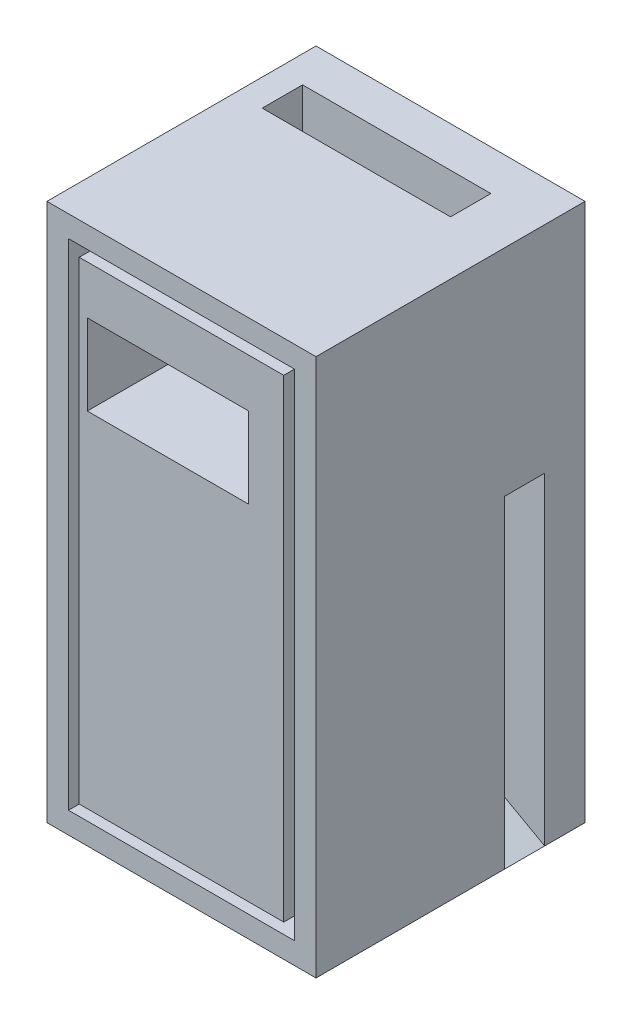
ISO-10303-21;
HEADER;
FILE_DESCRIPTION(('STEP AP214'),'2;1');
FILE_NAME('part.step','',(''),(''),'','','');
FILE_SCHEMA(('AUTOMOTIVE_DESIGN { 1 0 10303 214 1 1 1 1 }'));
ENDSEC;
DATA;
#1=APPLICATION_CONTEXT('core data for automotive mechanical design processes');
#2=APPLICATION_PROTOCOL_DEFINITION('international standard','automotive_design',2000,#1);
#3=PRODUCT_CONTEXT('',#1,'mechanical');
#4=PRODUCT('Part','Part','',(#3));
#5=PRODUCT_RELATED_PRODUCT_CATEGORY('part','',(#4));
#6=PRODUCT_DEFINITION_FORMATION('','',#4);
#7=PRODUCT_DEFINITION_CONTEXT('part definition',#1,'design');
#8=PRODUCT_DEFINITION('design','',#6,#7);
#9=PRODUCT_DEFINITION_SHAPE('','',#8);
#10=(LENGTH_UNIT() NAMED_UNIT(*) SI_UNIT(.MILLI.,.METRE.));
#11=(NAMED_UNIT(*) PLANE_ANGLE_UNIT() SI_UNIT($,.RADIAN.));
#12=(NAMED_UNIT(*) SI_UNIT($,.STERADIAN.) SOLID_ANGLE_UNIT());
#13=UNCERTAINTY_MEASURE_WITH_UNIT(LENGTH_MEASURE(1.E-05),#10,'distance_accuracy_value','');
#14=(GEOMETRIC_REPRESENTATION_CONTEXT(3) GLOBAL_UNCERTAINTY_ASSIGNED_CONTEXT((#13)) GLOBAL_UNIT_ASSIGNED_CONTEXT((#10,
#11,#12)) REPRESENTATION_CONTEXT('',''));
#15=CARTESIAN_POINT('',(0.,0.,0.));
#16=DIRECTION('',(0.,0.,1.));
#17=DIRECTION('',(1.,0.,0.));
#18=AXIS2_PLACEMENT_3D('',#15,#16,#17);
#19=CARTESIAN_POINT('',(0.,0.,25.));
#20=DIRECTION('',(0.,0.,-1.));
#21=DIRECTION('',(-1.,0.,0.));
#22=AXIS2_PLACEMENT_3D('',#19,#20,#21);
#23=PLANE('',#22);
#24=DIRECTION('',(1.,0.,0.));
#25=VECTOR('',#24,1.);
#26=CARTESIAN_POINT('',(2.5,70.,25.));
#27=LINE('',#26,#25);
#28=CARTESIAN_POINT('',(2.5,70.,25.));
#29=VERTEX_POINT('',#28);
#30=CARTESIAN_POINT('',(32.5,70.,25.));
#31=VERTEX_POINT('',#30);
#32=EDGE_CURVE('E270',#29,#31,#27,.T.);
#33=ORIENTED_EDGE('',*,*,#32,.F.);
#34=DIRECTION('',(0.,-1.,0.));
#35=VECTOR('',#34,1.);
#36=CARTESIAN_POINT('',(2.5,70.,25.));
#37=LINE('',#36,#35);
#38=CARTESIAN_POINT('',(2.5,85.,25.));
#39=VERTEX_POINT('',#38);
#40=EDGE_CURVE('E273',#39,#29,#37,.T.);
#41=ORIENTED_EDGE('',*,*,#40,.F.);
#42=DIRECTION('',(-1.,0.,0.));
#43=VECTOR('',#42,1.);
#44=CARTESIAN_POINT('',(2.5,85.,25.));
#45=LINE('',#44,#43);
#46=CARTESIAN_POINT('',(32.5,85.,25.));
#47=VERTEX_POINT('',#46);
#48=EDGE_CURVE('E264',#47,#39,#45,.T.);
#49=ORIENTED_EDGE('',*,*,#48,.F.);
#50=DIRECTION('',(0.,1.,0.));
#51=VECTOR('',#50,1.);
#52=CARTESIAN_POINT('',(32.5,70.,25.));
#53=LINE('',#52,#51);
#54=EDGE_CURVE('E267',#31,#47,#53,.T.);
#55=ORIENTED_EDGE('',*,*,#54,.F.);
#56=EDGE_LOOP('',(#33,#41,#49,#55));
#57=FACE_BOUND('',#56,.T.);
#58=DIRECTION('',(0.,-1.,0.));
#59=VECTOR('',#58,1.);
#60=CARTESIAN_POINT('',(1.,94.,25.));
#61=LINE('',#60,#59);
#62=CARTESIAN_POINT('',(1.,94.,25.));
#63=VERTEX_POINT('',#62);
#64=CARTESIAN_POINT('',(1.,6.,25.));
#65=VERTEX_POINT('',#64);
#66=EDGE_CURVE('E221',#63,#65,#61,.T.);
#67=ORIENTED_EDGE('',*,*,#66,.T.);
#68=DIRECTION('',(1.,0.,0.));
#69=VECTOR('',#68,1.);
#70=CARTESIAN_POINT('',(1.,6.,25.));
#71=LINE('',#70,#69);
#72=CARTESIAN_POINT('',(39.,6.,25.));
#73=VERTEX_POINT('',#72);
#74=EDGE_CURVE('E194',#65,#73,#71,.T.);
#75=ORIENTED_EDGE('',*,*,#74,.T.);
#76=DIRECTION('',(0.,1.,0.));
#77=VECTOR('',#76,1.);
#78=CARTESIAN_POINT('',(39.,6.,25.));
#79=LINE('',#78,#77);
#80=CARTESIAN_POINT('',(39.,94.,25.));
#81=VERTEX_POINT('',#80);
#82=EDGE_CURVE('E62',#73,#81,#79,.T.);
#83=ORIENTED_EDGE('',*,*,#82,.T.);
#84=DIRECTION('',(-1.,0.,0.));
#85=VECTOR('',#84,1.);
#86=CARTESIAN_POINT('',(39.,94.,25.));
#87=LINE('',#86,#85);
#88=EDGE_CURVE('E214',#81,#63,#87,.T.);
#89=ORIENTED_EDGE('',*,*,#88,.T.);
#90=EDGE_LOOP('',(#67,#75,#83,#89));
#91=FACE_BOUND('',#90,.T.);
#92=ADVANCED_FACE('F39',(#57,#91),#23,.F.);
#93=CARTESIAN_POINT('',(45.,100.,-10.));
#94=DIRECTION('',(0.,0.,1.));
#95=DIRECTION('',(1.,0.,0.));
#96=AXIS2_PLACEMENT_3D('',#93,#94,#95);
#97=PLANE('',#96);
#98=DIRECTION('',(1.,0.,0.));
#99=VECTOR('',#98,1.);
#100=CARTESIAN_POINT('',(2.50000000000001,85.,-10.));
#101=LINE('',#100,#99);
#102=CARTESIAN_POINT('',(2.5,85.,-10.));
#103=VERTEX_POINT('',#102);
#104=CARTESIAN_POINT('',(32.5,85.,-10.));
#105=VERTEX_POINT('',#104);
#106=EDGE_CURVE('E278',#103,#105,#101,.T.);
#107=ORIENTED_EDGE('',*,*,#106,.F.);
#108=DIRECTION('',(0.,1.,0.));
#109=VECTOR('',#108,1.);
#110=CARTESIAN_POINT('',(2.5,70.,-10.));
#111=LINE('',#110,#109);
#112=CARTESIAN_POINT('',(2.5,70.,-10.));
#113=VERTEX_POINT('',#112);
#114=EDGE_CURVE('E263',#113,#103,#111,.T.);
#115=ORIENTED_EDGE('',*,*,#114,.F.);
#116=DIRECTION('',(-1.,0.,0.));
#117=VECTOR('',#116,1.);
#118=CARTESIAN_POINT('',(2.50000000000001,70.,-10.));
#119=LINE('',#118,#117);
#120=CARTESIAN_POINT('',(32.5,70.,-10.));
#121=VERTEX_POINT('',#120);
#122=EDGE_CURVE('E260',#121,#113,#119,.T.);
#123=ORIENTED_EDGE('',*,*,#122,.F.);
#124=DIRECTION('',(0.,-1.,0.));
#125=VECTOR('',#124,1.);
#126=CARTESIAN_POINT('',(32.5,70.,-10.));
#127=LINE('',#126,#125);
#128=EDGE_CURVE('E281',#105,#121,#127,.T.);
#129=ORIENTED_EDGE('',*,*,#128,.F.);
#130=EDGE_LOOP('',(#107,#115,#123,#129));
#131=FACE_BOUND('',#130,.T.);
#132=DIRECTION('',(0.,-1.,0.));
#133=VECTOR('',#132,1.);
#134=CARTESIAN_POINT('',(35.,100.,-10.));
#135=LINE('',#134,#133);
#136=CARTESIAN_POINT('',(35.,100.,-10.));
#137=VERTEX_POINT('',#136);
#138=CARTESIAN_POINT('',(35.,60.,-9.99999999999999));
#139=VERTEX_POINT('',#138);
#140=EDGE_CURVE('E299',#137,#139,#135,.T.);
#141=ORIENTED_EDGE('',*,*,#140,.T.);
#142=DIRECTION('',(1.,0.,0.));
#143=VECTOR('',#142,1.);
#144=CARTESIAN_POINT('',(45.,60.,-10.));
#145=LINE('',#144,#143);
#146=CARTESIAN_POINT('',(45.,60.,-10.));
#147=VERTEX_POINT('',#146);
#148=EDGE_CURVE('E293',#139,#147,#145,.T.);
#149=ORIENTED_EDGE('',*,*,#148,.T.);
#150=DIRECTION('',(0.,-1.,0.));
#151=VECTOR('',#150,1.);
#152=CARTESIAN_POINT('',(45.,100.,-10.));
#153=LINE('',#152,#151);
#154=CARTESIAN_POINT('',(45.,0.,-10.));
#155=VERTEX_POINT('',#154);
#156=EDGE_CURVE('E343',#147,#155,#153,.T.);
#157=ORIENTED_EDGE('',*,*,#156,.T.);
#158=DIRECTION('',(-0.874157276121538,0.485642931178632,0.));
#159=VECTOR('',#158,1.);
#160=CARTESIAN_POINT('',(45.,0.,-10.));
#161=LINE('',#160,#159);
#162=CARTESIAN_POINT('',(0.,25.,-9.99999999999999));
#163=VERTEX_POINT('',#162);
#164=EDGE_CURVE('E345',#155,#163,#161,.T.);
#165=ORIENTED_EDGE('',*,*,#164,.T.);
#166=DIRECTION('',(0.,-1.,0.));
#167=VECTOR('',#166,1.);
#168=CARTESIAN_POINT('',(0.,109.01387818866,-9.99999999999999));
#169=LINE('',#168,#167);
#170=CARTESIAN_POINT('',(0.,100.,-9.99999999999999));
#171=VERTEX_POINT('',#170);
#172=EDGE_CURVE('E302',#171,#163,#169,.T.);
#173=ORIENTED_EDGE('',*,*,#172,.F.);
#174=DIRECTION('',(-1.,0.,0.));
#175=VECTOR('',#174,1.);
#176=CARTESIAN_POINT('',(45.,100.,-10.));
#177=LINE('',#176,#175);
#178=EDGE_CURVE('E334',#137,#171,#177,.T.);
#179=ORIENTED_EDGE('',*,*,#178,.F.);
#180=EDGE_LOOP('',(#141,#149,#157,#165,#173,#179));
#181=FACE_BOUND('',#180,.T.);
#182=ADVANCED_FACE('F384',(#131,#181),#97,.F.);
#183=CARTESIAN_POINT('',(-5.,100.,-17.5));
#184=DIRECTION('',(0.,0.,-1.));
#185=DIRECTION('',(-1.,0.,0.));
#186=AXIS2_PLACEMENT_3D('',#183,#184,#185);
#187=PLANE('',#186);
#188=DIRECTION('',(0.,-1.,0.));
#189=VECTOR('',#188,1.);
#190=CARTESIAN_POINT('',(35.,100.,-17.5));
#191=LINE('',#190,#189);
#192=CARTESIAN_POINT('',(35.,100.,-17.5));
#193=VERTEX_POINT('',#192);
#194=CARTESIAN_POINT('',(35.,60.,-17.5));
#195=VERTEX_POINT('',#194);
#196=EDGE_CURVE('E295',#193,#195,#191,.T.);
#197=ORIENTED_EDGE('',*,*,#196,.F.);
#198=DIRECTION('',(1.,0.,0.));
#199=VECTOR('',#198,1.);
#200=CARTESIAN_POINT('',(-5.,100.,-17.5));
#201=LINE('',#200,#199);
#202=CARTESIAN_POINT('',(0.,100.,-17.5));
#203=VERTEX_POINT('',#202);
#204=EDGE_CURVE('E325',#203,#193,#201,.T.);
#205=ORIENTED_EDGE('',*,*,#204,.F.);
#206=DIRECTION('',(0.,-1.,0.));
#207=VECTOR('',#206,1.);
#208=CARTESIAN_POINT('',(0.,109.01387818866,-17.5));
#209=LINE('',#208,#207);
#210=CARTESIAN_POINT('',(0.,25.,-17.5));
#211=VERTEX_POINT('',#210);
#212=EDGE_CURVE('E312',#203,#211,#209,.T.);
#213=ORIENTED_EDGE('',*,*,#212,.T.);
#214=DIRECTION('',(0.874157276121538,-0.485642931178632,0.));
#215=VECTOR('',#214,1.);
#216=CARTESIAN_POINT('',(45.,0.,-17.5));
#217=LINE('',#216,#215);
#218=CARTESIAN_POINT('',(45.,0.,-17.5));
#219=VERTEX_POINT('',#218);
#220=EDGE_CURVE('E324',#211,#219,#217,.T.);
#221=ORIENTED_EDGE('',*,*,#220,.T.);
#222=DIRECTION('',(0.,-1.,0.));
#223=VECTOR('',#222,1.);
#224=CARTESIAN_POINT('',(45.,100.,-17.5));
#225=LINE('',#224,#223);
#226=CARTESIAN_POINT('',(45.,60.,-17.5));
#227=VERTEX_POINT('',#226);
#228=EDGE_CURVE('E311',#227,#219,#225,.T.);
#229=ORIENTED_EDGE('',*,*,#228,.F.);
#230=DIRECTION('',(1.,0.,0.));
#231=VECTOR('',#230,1.);
#232=CARTESIAN_POINT('',(45.,60.,-17.5));
#233=LINE('',#232,#231);
#234=EDGE_CURVE('E291',#195,#227,#233,.T.);
#235=ORIENTED_EDGE('',*,*,#234,.F.);
#236=EDGE_LOOP('',(#197,#205,#213,#221,#229,#235));
#237=FACE_BOUND('',#236,.T.);
#238=ADVANCED_FACE('F375',(#237),#187,.F.);
#239=CARTESIAN_POINT('',(45.,0.,25.));
#240=DIRECTION('',(-0.485642931178632,-0.874157276121538,0.));
#241=DIRECTION('',(0.874157276121538,-0.485642931178632,0.));
#242=AXIS2_PLACEMENT_3D('',#239,#240,#241);
#243=PLANE('',#242);
#244=ORIENTED_EDGE('',*,*,#220,.F.);
#245=DIRECTION('',(0.,0.,-1.));
#246=VECTOR('',#245,1.);
#247=CARTESIAN_POINT('',(0.,25.,25.));
#248=LINE('',#247,#246);
#249=EDGE_CURVE('E359',#163,#211,#248,.T.);
#250=ORIENTED_EDGE('',*,*,#249,.F.);
#251=ORIENTED_EDGE('',*,*,#164,.F.);
#252=DIRECTION('',(0.,0.,-1.));
#253=VECTOR('',#252,1.);
#254=CARTESIAN_POINT('',(45.,0.,25.));
#255=LINE('',#254,#253);
#256=EDGE_CURVE('E47',#155,#219,#255,.T.);
#257=ORIENTED_EDGE('',*,*,#256,.T.);
#258=EDGE_LOOP('',(#244,#250,#251,#257));
#259=FACE_BOUND('',#258,.T.);
#260=ADVANCED_FACE('F368',(#259),#243,.F.);
#261=CARTESIAN_POINT('',(0.,0.,25.));
#262=DIRECTION('',(0.,1.,0.));
#263=DIRECTION('',(0.,0.,1.));
#264=AXIS2_PLACEMENT_3D('',#261,#262,#263);
#265=PLANE('',#264);
#266=DIRECTION('',(0.,0.,-1.));
#267=VECTOR('',#266,1.);
#268=CARTESIAN_POINT('',(45.,0.,-25.));
#269=LINE('',#268,#267);
#270=CARTESIAN_POINT('',(45.,0.,-25.));
#271=VERTEX_POINT('',#270);
#272=EDGE_CURVE('E321',#219,#271,#269,.T.);
#273=ORIENTED_EDGE('',*,*,#272,.F.);
#274=ORIENTED_EDGE('',*,*,#256,.F.);
#275=CARTESIAN_POINT('',(45.,0.,25.));
#276=VERTEX_POINT('',#275);
#277=EDGE_CURVE('E11',#276,#155,#255,.T.);
#278=ORIENTED_EDGE('',*,*,#277,.F.);
#279=DIRECTION('',(1.,0.,0.));
#280=VECTOR('',#279,1.);
#281=CARTESIAN_POINT('',(0.,0.,25.));
#282=LINE('',#281,#280);
#283=CARTESIAN_POINT('',(-5.,0.,25.));
#284=VERTEX_POINT('',#283);
#285=EDGE_CURVE('E349',#284,#276,#282,.T.);
#286=ORIENTED_EDGE('',*,*,#285,.F.);
#287=DIRECTION('',(0.,0.,-1.));
#288=VECTOR('',#287,1.);
#289=CARTESIAN_POINT('',(-5.,0.,25.));
#290=LINE('',#289,#288);
#291=CARTESIAN_POINT('',(-5.,0.,-25.));
#292=VERTEX_POINT('',#291);
#293=EDGE_CURVE('E355',#284,#292,#290,.T.);
#294=ORIENTED_EDGE('',*,*,#293,.T.);
#295=DIRECTION('',(1.,0.,0.));
#296=VECTOR('',#295,1.);
#297=CARTESIAN_POINT('',(0.,0.,-25.));
#298=LINE('',#297,#296);
#299=EDGE_CURVE('E348',#292,#271,#298,.T.);
#300=ORIENTED_EDGE('',*,*,#299,.T.);
#301=EDGE_LOOP('',(#273,#274,#278,#286,#294,#300));
#302=FACE_BOUND('',#301,.T.);
#303=ADVANCED_FACE('F41',(#302),#265,.F.);
#304=CARTESIAN_POINT('',(-5.,0.,25.));
#305=DIRECTION('',(1.,0.,0.));
#306=DIRECTION('',(0.,0.,-1.));
#307=AXIS2_PLACEMENT_3D('',#304,#305,#306);
#308=PLANE('',#307);
#309=DIRECTION('',(0.,-1.,0.));
#310=VECTOR('',#309,1.);
#311=CARTESIAN_POINT('',(-5.,0.,-25.));
#312=LINE('',#311,#310);
#313=CARTESIAN_POINT('',(-5.,100.,-25.));
#314=VERTEX_POINT('',#313);
#315=EDGE_CURVE('E353',#314,#292,#312,.T.);
#316=ORIENTED_EDGE('',*,*,#315,.T.);
#317=ORIENTED_EDGE('',*,*,#293,.F.);
#318=DIRECTION('',(0.,-1.,0.));
#319=VECTOR('',#318,1.);
#320=CARTESIAN_POINT('',(-5.,0.,25.));
#321=LINE('',#320,#319);
#322=CARTESIAN_POINT('',(-5.,100.,25.));
#323=VERTEX_POINT('',#322);
#324=EDGE_CURVE('E352',#323,#284,#321,.T.);
#325=ORIENTED_EDGE('',*,*,#324,.F.);
#326=DIRECTION('',(0.,0.,1.));
#327=VECTOR('',#326,1.);
#328=CARTESIAN_POINT('',(-5.,100.,25.));
#329=LINE('',#328,#327);
#330=EDGE_CURVE('E336',#314,#323,#329,.T.);
#331=ORIENTED_EDGE('',*,*,#330,.F.);
#332=EDGE_LOOP('',(#316,#317,#325,#331));
#333=FACE_BOUND('',#332,.T.);
#334=ADVANCED_FACE('F398',(#333),#308,.F.);
#335=DIRECTION('',(1.,0.,0.));
#336=VECTOR('',#335,1.);
#337=CARTESIAN_POINT('',(-1.,4.,25.));
#338=LINE('',#337,#336);
#339=CARTESIAN_POINT('',(-1.,4.,25.));
#340=VERTEX_POINT('',#339);
#341=CARTESIAN_POINT('',(41.,4.,25.));
#342=VERTEX_POINT('',#341);
#343=EDGE_CURVE('E244',#340,#342,#338,.T.);
#344=ORIENTED_EDGE('',*,*,#343,.F.);
#345=DIRECTION('',(0.,-1.,0.));
#346=VECTOR('',#345,1.);
#347=CARTESIAN_POINT('',(-1.,96.,25.));
#348=LINE('',#347,#346);
#349=CARTESIAN_POINT('',(-1.,96.,25.));
#350=VERTEX_POINT('',#349);
#351=EDGE_CURVE('E54',#350,#340,#348,.T.);
#352=ORIENTED_EDGE('',*,*,#351,.F.);
#353=DIRECTION('',(-1.,0.,0.));
#354=VECTOR('',#353,1.);
#355=CARTESIAN_POINT('',(41.,96.,25.));
#356=LINE('',#355,#354);
#357=CARTESIAN_POINT('',(41.,96.,25.));
#358=VERTEX_POINT('',#357);
#359=EDGE_CURVE('E233',#358,#350,#356,.T.);
#360=ORIENTED_EDGE('',*,*,#359,.F.);
#361=DIRECTION('',(0.,1.,0.));
#362=VECTOR('',#361,1.);
#363=CARTESIAN_POINT('',(41.,4.,25.));
#364=LINE('',#363,#362);
#365=EDGE_CURVE('E247',#342,#358,#364,.T.);
#366=ORIENTED_EDGE('',*,*,#365,.F.);
#367=EDGE_LOOP('',(#344,#352,#360,#366));
#368=FACE_BOUND('',#367,.T.);
#369=ORIENTED_EDGE('',*,*,#285,.T.);
#370=DIRECTION('',(0.,-1.,0.));
#371=VECTOR('',#370,1.);
#372=CARTESIAN_POINT('',(45.,100.,25.));
#373=LINE('',#372,#371);
#374=CARTESIAN_POINT('',(45.,100.,25.));
#375=VERTEX_POINT('',#374);
#376=EDGE_CURVE('E341',#375,#276,#373,.T.);
#377=ORIENTED_EDGE('',*,*,#376,.F.);
#378=DIRECTION('',(1.,0.,0.));
#379=VECTOR('',#378,1.);
#380=CARTESIAN_POINT('',(45.,100.,25.));
#381=LINE('',#380,#379);
#382=EDGE_CURVE('E339',#323,#375,#381,.T.);
#383=ORIENTED_EDGE('',*,*,#382,.F.);
#384=ORIENTED_EDGE('',*,*,#324,.T.);
#385=EDGE_LOOP('',(#369,#377,#383,#384));
#386=FACE_BOUND('',#385,.T.);
#387=ADVANCED_FACE('F395',(#368,#386),#23,.F.);
#388=CARTESIAN_POINT('',(0.,0.,-25.));
#389=DIRECTION('',(0.,0.,-1.));
#390=DIRECTION('',(-1.,0.,0.));
#391=AXIS2_PLACEMENT_3D('',#388,#389,#390);
#392=PLANE('',#391);
#393=ORIENTED_EDGE('',*,*,#299,.F.);
#394=ORIENTED_EDGE('',*,*,#315,.F.);
#395=DIRECTION('',(-1.,0.,0.));
#396=VECTOR('',#395,1.);
#397=CARTESIAN_POINT('',(-5.,100.,-25.));
#398=LINE('',#397,#396);
#399=CARTESIAN_POINT('',(45.,100.,-25.));
#400=VERTEX_POINT('',#399);
#401=EDGE_CURVE('E320',#400,#314,#398,.T.);
#402=ORIENTED_EDGE('',*,*,#401,.F.);
#403=DIRECTION('',(0.,-1.,0.));
#404=VECTOR('',#403,1.);
#405=CARTESIAN_POINT('',(45.,100.,-25.));
#406=LINE('',#405,#404);
#407=EDGE_CURVE('E317',#400,#271,#406,.T.);
#408=ORIENTED_EDGE('',*,*,#407,.T.);
#409=EDGE_LOOP('',(#393,#394,#402,#408));
#410=FACE_BOUND('',#409,.T.);
#411=ADVANCED_FACE('F402',(#410),#392,.T.);
#412=CARTESIAN_POINT('',(45.,100.,25.));
#413=DIRECTION('',(-1.,0.,0.));
#414=DIRECTION('',(0.,0.,1.));
#415=AXIS2_PLACEMENT_3D('',#412,#413,#414);
#416=PLANE('',#415);
#417=ORIENTED_EDGE('',*,*,#277,.T.);
#418=ORIENTED_EDGE('',*,*,#156,.F.);
#419=DIRECTION('',(0.,0.,-1.));
#420=VECTOR('',#419,1.);
#421=CARTESIAN_POINT('',(45.,60.,31.2310562561766));
#422=LINE('',#421,#420);
#423=EDGE_CURVE('E283',#147,#227,#422,.T.);
#424=ORIENTED_EDGE('',*,*,#423,.T.);
#425=ORIENTED_EDGE('',*,*,#228,.T.);
#426=ORIENTED_EDGE('',*,*,#272,.T.);
#427=ORIENTED_EDGE('',*,*,#407,.F.);
#428=DIRECTION('',(0.,0.,-1.));
#429=VECTOR('',#428,1.);
#430=CARTESIAN_POINT('',(45.,100.,25.));
#431=LINE('',#430,#429);
#432=EDGE_CURVE('E332',#375,#400,#431,.T.);
#433=ORIENTED_EDGE('',*,*,#432,.F.);
#434=ORIENTED_EDGE('',*,*,#376,.T.);
#435=EDGE_LOOP('',(#417,#418,#424,#425,#426,#427,#433,#434));
#436=FACE_BOUND('',#435,.T.);
#437=ADVANCED_FACE('F388',(#436),#416,.F.);
#438=CARTESIAN_POINT('',(0.,100.,0.));
#439=DIRECTION('',(0.,1.,0.));
#440=DIRECTION('',(0.,0.,1.));
#441=AXIS2_PLACEMENT_3D('',#438,#439,#440);
#442=PLANE('',#441);
#443=ORIENTED_EDGE('',*,*,#204,.T.);
#444=DIRECTION('',(0.,0.,-1.));
#445=VECTOR('',#444,1.);
#446=CARTESIAN_POINT('',(35.,100.,31.2310562561766));
#447=LINE('',#446,#445);
#448=EDGE_CURVE('E298',#137,#193,#447,.T.);
#449=ORIENTED_EDGE('',*,*,#448,.F.);
#450=ORIENTED_EDGE('',*,*,#178,.T.);
#451=DIRECTION('',(0.,0.,-1.));
#452=VECTOR('',#451,1.);
#453=CARTESIAN_POINT('',(0.,100.,-17.5));
#454=LINE('',#453,#452);
#455=EDGE_CURVE('E309',#171,#203,#454,.T.);
#456=ORIENTED_EDGE('',*,*,#455,.T.);
#457=EDGE_LOOP('',(#443,#449,#450,#456));
#458=FACE_BOUND('',#457,.T.);
#459=ORIENTED_EDGE('',*,*,#432,.T.);
#460=ORIENTED_EDGE('',*,*,#401,.T.);
#461=ORIENTED_EDGE('',*,*,#330,.T.);
#462=ORIENTED_EDGE('',*,*,#382,.T.);
#463=EDGE_LOOP('',(#459,#460,#461,#462));
#464=FACE_BOUND('',#463,.T.);
#465=ADVANCED_FACE('F404',(#458,#464),#442,.T.);
#466=CARTESIAN_POINT('',(0.,109.01387818866,-17.5));
#467=DIRECTION('',(-1.,0.,0.));
#468=DIRECTION('',(0.,0.,1.));
#469=AXIS2_PLACEMENT_3D('',#466,#467,#468);
#470=PLANE('',#469);
#471=ORIENTED_EDGE('',*,*,#455,.F.);
#472=ORIENTED_EDGE('',*,*,#172,.T.);
#473=ORIENTED_EDGE('',*,*,#249,.T.);
#474=ORIENTED_EDGE('',*,*,#212,.F.);
#475=EDGE_LOOP('',(#471,#472,#473,#474));
#476=FACE_BOUND('',#475,.T.);
#477=ADVANCED_FACE('F379',(#476),#470,.F.);
#478=CARTESIAN_POINT('',(35.,100.,31.2310562561766));
#479=DIRECTION('',(1.,0.,0.));
#480=DIRECTION('',(0.,1.,0.));
#481=AXIS2_PLACEMENT_3D('',#478,#479,#480);
#482=PLANE('',#481);
#483=ORIENTED_EDGE('',*,*,#140,.F.);
#484=ORIENTED_EDGE('',*,*,#448,.T.);
#485=ORIENTED_EDGE('',*,*,#196,.T.);
#486=DIRECTION('',(0.,0.,-1.));
#487=VECTOR('',#486,1.);
#488=CARTESIAN_POINT('',(35.,60.,31.2310562561766));
#489=LINE('',#488,#487);
#490=EDGE_CURVE('E294',#139,#195,#489,.T.);
#491=ORIENTED_EDGE('',*,*,#490,.F.);
#492=EDGE_LOOP('',(#483,#484,#485,#491));
#493=FACE_BOUND('',#492,.T.);
#494=ADVANCED_FACE('F410',(#493),#482,.F.);
#495=CARTESIAN_POINT('',(45.,60.,31.2310562561766));
#496=DIRECTION('',(0.,1.,0.));
#497=DIRECTION('',(0.,0.,1.));
#498=AXIS2_PLACEMENT_3D('',#495,#496,#497);
#499=PLANE('',#498);
#500=ORIENTED_EDGE('',*,*,#148,.F.);
#501=ORIENTED_EDGE('',*,*,#490,.T.);
#502=ORIENTED_EDGE('',*,*,#234,.T.);
#503=ORIENTED_EDGE('',*,*,#423,.F.);
#504=EDGE_LOOP('',(#500,#501,#502,#503));
#505=FACE_BOUND('',#504,.T.);
#506=ADVANCED_FACE('F407',(#505),#499,.F.);
#507=CARTESIAN_POINT('',(2.5,70.,-25.001));
#508=DIRECTION('',(-1.,0.,0.));
#509=DIRECTION('',(0.,0.,1.));
#510=AXIS2_PLACEMENT_3D('',#507,#508,#509);
#511=PLANE('',#510);
#512=ORIENTED_EDGE('',*,*,#114,.T.);
#513=DIRECTION('',(0.,0.,1.));
#514=VECTOR('',#513,1.);
#515=CARTESIAN_POINT('',(2.5,85.,-25.001));
#516=LINE('',#515,#514);
#517=EDGE_CURVE('E284',#103,#39,#516,.T.);
#518=ORIENTED_EDGE('',*,*,#517,.T.);
#519=ORIENTED_EDGE('',*,*,#40,.T.);
#520=DIRECTION('',(0.,0.,1.));
#521=VECTOR('',#520,1.);
#522=CARTESIAN_POINT('',(2.5,70.,-25.001));
#523=LINE('',#522,#521);
#524=EDGE_CURVE('E254',#113,#29,#523,.T.);
#525=ORIENTED_EDGE('',*,*,#524,.F.);
#526=EDGE_LOOP('',(#512,#518,#519,#525));
#527=FACE_BOUND('',#526,.T.);
#528=ADVANCED_FACE('F417',(#527),#511,.F.);
#529=CARTESIAN_POINT('',(2.5,85.,-25.001));
#530=DIRECTION('',(0.,1.,0.));
#531=DIRECTION('',(0.,0.,1.));
#532=AXIS2_PLACEMENT_3D('',#529,#530,#531);
#533=PLANE('',#532);
#534=ORIENTED_EDGE('',*,*,#106,.T.);
#535=DIRECTION('',(0.,0.,1.));
#536=VECTOR('',#535,1.);
#537=CARTESIAN_POINT('',(32.5,85.,-25.001));
#538=LINE('',#537,#536);
#539=EDGE_CURVE('E286',#105,#47,#538,.T.);
#540=ORIENTED_EDGE('',*,*,#539,.T.);
#541=ORIENTED_EDGE('',*,*,#48,.T.);
#542=ORIENTED_EDGE('',*,*,#517,.F.);
#543=EDGE_LOOP('',(#534,#540,#541,#542));
#544=FACE_BOUND('',#543,.T.);
#545=ADVANCED_FACE('F473',(#544),#533,.F.);
#546=CARTESIAN_POINT('',(32.5,70.,-25.001));
#547=DIRECTION('',(1.,0.,0.));
#548=DIRECTION('',(0.,0.,-1.));
#549=AXIS2_PLACEMENT_3D('',#546,#547,#548);
#550=PLANE('',#549);
#551=ORIENTED_EDGE('',*,*,#128,.T.);
#552=DIRECTION('',(0.,0.,1.));
#553=VECTOR('',#552,1.);
#554=CARTESIAN_POINT('',(32.5,70.,-25.001));
#555=LINE('',#554,#553);
#556=EDGE_CURVE('E275',#121,#31,#555,.T.);
#557=ORIENTED_EDGE('',*,*,#556,.T.);
#558=ORIENTED_EDGE('',*,*,#54,.T.);
#559=ORIENTED_EDGE('',*,*,#539,.F.);
#560=EDGE_LOOP('',(#551,#557,#558,#559));
#561=FACE_BOUND('',#560,.T.);
#562=ADVANCED_FACE('F469',(#561),#550,.F.);
#563=CARTESIAN_POINT('',(2.5,70.,-25.001));
#564=DIRECTION('',(0.,-1.,0.));
#565=DIRECTION('',(0.,0.,-1.));
#566=AXIS2_PLACEMENT_3D('',#563,#564,#565);
#567=PLANE('',#566);
#568=ORIENTED_EDGE('',*,*,#122,.T.);
#569=ORIENTED_EDGE('',*,*,#524,.T.);
#570=ORIENTED_EDGE('',*,*,#32,.T.);
#571=ORIENTED_EDGE('',*,*,#556,.F.);
#572=EDGE_LOOP('',(#568,#569,#570,#571));
#573=FACE_BOUND('',#572,.T.);
#574=ADVANCED_FACE('F467',(#573),#567,.F.);
#575=CARTESIAN_POINT('',(-1.,96.,10.));
#576=DIRECTION('',(-1.,0.,0.));
#577=DIRECTION('',(0.,0.,1.));
#578=AXIS2_PLACEMENT_3D('',#575,#576,#577);
#579=PLANE('',#578);
#580=ORIENTED_EDGE('',*,*,#351,.T.);
#581=DIRECTION('',(0.,0.,1.));
#582=VECTOR('',#581,1.);
#583=CARTESIAN_POINT('',(-1.,4.,10.));
#584=LINE('',#583,#582);
#585=CARTESIAN_POINT('',(-1.,4.,10.));
#586=VERTEX_POINT('',#585);
#587=EDGE_CURVE('E242',#586,#340,#584,.T.);
#588=ORIENTED_EDGE('',*,*,#587,.F.);
#589=DIRECTION('',(0.,-1.,0.));
#590=VECTOR('',#589,1.);
#591=CARTESIAN_POINT('',(-1.,96.,10.));
#592=LINE('',#591,#590);
#593=CARTESIAN_POINT('',(-1.,96.,10.));
#594=VERTEX_POINT('',#593);
#595=EDGE_CURVE('E229',#594,#586,#592,.T.);
#596=ORIENTED_EDGE('',*,*,#595,.F.);
#597=DIRECTION('',(0.,0.,1.));
#598=VECTOR('',#597,1.);
#599=CARTESIAN_POINT('',(-1.,96.,10.));
#600=LINE('',#599,#598);
#601=EDGE_CURVE('E252',#594,#350,#600,.T.);
#602=ORIENTED_EDGE('',*,*,#601,.T.);
#603=EDGE_LOOP('',(#580,#588,#596,#602));
#604=FACE_BOUND('',#603,.T.);
#605=ADVANCED_FACE('F450',(#604),#579,.F.);
#606=CARTESIAN_POINT('',(41.,96.,10.));
#607=DIRECTION('',(0.,1.,0.));
#608=DIRECTION('',(0.,0.,1.));
#609=AXIS2_PLACEMENT_3D('',#606,#607,#608);
#610=PLANE('',#609);
#611=ORIENTED_EDGE('',*,*,#359,.T.);
#612=ORIENTED_EDGE('',*,*,#601,.F.);
#613=DIRECTION('',(-1.,0.,0.));
#614=VECTOR('',#613,1.);
#615=CARTESIAN_POINT('',(41.,96.,10.));
#616=LINE('',#615,#614);
#617=CARTESIAN_POINT('',(41.,96.,10.));
#618=VERTEX_POINT('',#617);
#619=EDGE_CURVE('E239',#618,#594,#616,.T.);
#620=ORIENTED_EDGE('',*,*,#619,.F.);
#621=DIRECTION('',(0.,0.,1.));
#622=VECTOR('',#621,1.);
#623=CARTESIAN_POINT('',(41.,96.,10.));
#624=LINE('',#623,#622);
#625=EDGE_CURVE('E255',#618,#358,#624,.T.);
#626=ORIENTED_EDGE('',*,*,#625,.T.);
#627=EDGE_LOOP('',(#611,#612,#620,#626));
#628=FACE_BOUND('',#627,.T.);
#629=ADVANCED_FACE('F453',(#628),#610,.F.);
#630=CARTESIAN_POINT('',(41.,4.,10.));
#631=DIRECTION('',(1.,0.,0.));
#632=DIRECTION('',(0.,0.,-1.));
#633=AXIS2_PLACEMENT_3D('',#630,#631,#632);
#634=PLANE('',#633);
#635=ORIENTED_EDGE('',*,*,#365,.T.);
#636=ORIENTED_EDGE('',*,*,#625,.F.);
#637=DIRECTION('',(0.,1.,0.));
#638=VECTOR('',#637,1.);
#639=CARTESIAN_POINT('',(41.,4.,10.));
#640=LINE('',#639,#638);
#641=CARTESIAN_POINT('',(41.,4.,10.));
#642=VERTEX_POINT('',#641);
#643=EDGE_CURVE('E236',#642,#618,#640,.T.);
#644=ORIENTED_EDGE('',*,*,#643,.F.);
#645=DIRECTION('',(0.,0.,1.));
#646=VECTOR('',#645,1.);
#647=CARTESIAN_POINT('',(41.,4.,10.));
#648=LINE('',#647,#646);
#649=EDGE_CURVE('E257',#642,#342,#648,.T.);
#650=ORIENTED_EDGE('',*,*,#649,.T.);
#651=EDGE_LOOP('',(#635,#636,#644,#650));
#652=FACE_BOUND('',#651,.T.);
#653=ADVANCED_FACE('F455',(#652),#634,.F.);
#654=CARTESIAN_POINT('',(-1.,4.,10.));
#655=DIRECTION('',(0.,-1.,0.));
#656=DIRECTION('',(0.,0.,-1.));
#657=AXIS2_PLACEMENT_3D('',#654,#655,#656);
#658=PLANE('',#657);
#659=ORIENTED_EDGE('',*,*,#343,.T.);
#660=ORIENTED_EDGE('',*,*,#649,.F.);
#661=DIRECTION('',(1.,0.,0.));
#662=VECTOR('',#661,1.);
#663=CARTESIAN_POINT('',(-1.,4.,10.));
#664=LINE('',#663,#662);
#665=EDGE_CURVE('E232',#586,#642,#664,.T.);
#666=ORIENTED_EDGE('',*,*,#665,.F.);
#667=ORIENTED_EDGE('',*,*,#587,.T.);
#668=EDGE_LOOP('',(#659,#660,#666,#667));
#669=FACE_BOUND('',#668,.T.);
#670=ADVANCED_FACE('F446',(#669),#658,.F.);
#671=CARTESIAN_POINT('',(0.,0.,10.));
#672=DIRECTION('',(0.,0.,1.));
#673=DIRECTION('',(1.,0.,0.));
#674=AXIS2_PLACEMENT_3D('',#671,#672,#673);
#675=PLANE('',#674);
#676=DIRECTION('',(-1.,0.,0.));
#677=VECTOR('',#676,1.);
#678=CARTESIAN_POINT('',(39.,94.,10.));
#679=LINE('',#678,#677);
#680=CARTESIAN_POINT('',(39.,94.,10.));
#681=VERTEX_POINT('',#680);
#682=CARTESIAN_POINT('',(1.,94.,10.));
#683=VERTEX_POINT('',#682);
#684=EDGE_CURVE('E200',#681,#683,#679,.T.);
#685=ORIENTED_EDGE('',*,*,#684,.F.);
#686=DIRECTION('',(0.,1.,0.));
#687=VECTOR('',#686,1.);
#688=CARTESIAN_POINT('',(39.,6.,10.));
#689=LINE('',#688,#687);
#690=CARTESIAN_POINT('',(39.,6.,10.));
#691=VERTEX_POINT('',#690);
#692=EDGE_CURVE('E210',#691,#681,#689,.T.);
#693=ORIENTED_EDGE('',*,*,#692,.F.);
#694=DIRECTION('',(1.,0.,0.));
#695=VECTOR('',#694,1.);
#696=CARTESIAN_POINT('',(1.,6.,10.));
#697=LINE('',#696,#695);
#698=CARTESIAN_POINT('',(1.,6.,10.));
#699=VERTEX_POINT('',#698);
#700=EDGE_CURVE('E192',#699,#691,#697,.T.);
#701=ORIENTED_EDGE('',*,*,#700,.F.);
#702=DIRECTION('',(0.,-1.,0.));
#703=VECTOR('',#702,1.);
#704=CARTESIAN_POINT('',(1.,94.,10.));
#705=LINE('',#704,#703);
#706=EDGE_CURVE('E207',#683,#699,#705,.T.);
#707=ORIENTED_EDGE('',*,*,#706,.F.);
#708=EDGE_LOOP('',(#685,#693,#701,#707));
#709=FACE_BOUND('',#708,.T.);
#710=ORIENTED_EDGE('',*,*,#595,.T.);
#711=ORIENTED_EDGE('',*,*,#665,.T.);
#712=ORIENTED_EDGE('',*,*,#643,.T.);
#713=ORIENTED_EDGE('',*,*,#619,.T.);
#714=EDGE_LOOP('',(#710,#711,#712,#713));
#715=FACE_BOUND('',#714,.T.);
#716=ADVANCED_FACE('F205',(#709,#715),#675,.T.);
#717=CARTESIAN_POINT('',(1.,94.,10.));
#718=DIRECTION('',(-1.,0.,0.));
#719=DIRECTION('',(0.,0.,1.));
#720=AXIS2_PLACEMENT_3D('',#717,#718,#719);
#721=PLANE('',#720);
#722=ORIENTED_EDGE('',*,*,#66,.F.);
#723=DIRECTION('',(0.,0.,1.));
#724=VECTOR('',#723,1.);
#725=CARTESIAN_POINT('',(1.,94.,10.));
#726=LINE('',#725,#724);
#727=EDGE_CURVE('E213',#683,#63,#726,.T.);
#728=ORIENTED_EDGE('',*,*,#727,.F.);
#729=ORIENTED_EDGE('',*,*,#706,.T.);
#730=DIRECTION('',(0.,0.,1.));
#731=VECTOR('',#730,1.);
#732=CARTESIAN_POINT('',(1.,6.,10.));
#733=LINE('',#732,#731);
#734=EDGE_CURVE('E189',#699,#65,#733,.T.);
#735=ORIENTED_EDGE('',*,*,#734,.T.);
#736=EDGE_LOOP('',(#722,#728,#729,#735));
#737=FACE_BOUND('',#736,.T.);
#738=ADVANCED_FACE('F212',(#737),#721,.T.);
#739=CARTESIAN_POINT('',(39.,94.,10.));
#740=DIRECTION('',(0.,1.,0.));
#741=DIRECTION('',(0.,0.,1.));
#742=AXIS2_PLACEMENT_3D('',#739,#740,#741);
#743=PLANE('',#742);
#744=ORIENTED_EDGE('',*,*,#88,.F.);
#745=DIRECTION('',(0.,0.,1.));
#746=VECTOR('',#745,1.);
#747=CARTESIAN_POINT('',(39.,94.,10.));
#748=LINE('',#747,#746);
#749=EDGE_CURVE('E226',#681,#81,#748,.T.);
#750=ORIENTED_EDGE('',*,*,#749,.F.);
#751=ORIENTED_EDGE('',*,*,#684,.T.);
#752=ORIENTED_EDGE('',*,*,#727,.T.);
#753=EDGE_LOOP('',(#744,#750,#751,#752));
#754=FACE_BOUND('',#753,.T.);
#755=ADVANCED_FACE('F554',(#754),#743,.T.);
#756=CARTESIAN_POINT('',(39.,6.,10.));
#757=DIRECTION('',(1.,0.,0.));
#758=DIRECTION('',(0.,0.,-1.));
#759=AXIS2_PLACEMENT_3D('',#756,#757,#758);
#760=PLANE('',#759);
#761=ORIENTED_EDGE('',*,*,#82,.F.);
#762=DIRECTION('',(0.,0.,1.));
#763=VECTOR('',#762,1.);
#764=CARTESIAN_POINT('',(39.,6.,10.));
#765=LINE('',#764,#763);
#766=EDGE_CURVE('E199',#691,#73,#765,.T.);
#767=ORIENTED_EDGE('',*,*,#766,.F.);
#768=ORIENTED_EDGE('',*,*,#692,.T.);
#769=ORIENTED_EDGE('',*,*,#749,.T.);
#770=EDGE_LOOP('',(#761,#767,#768,#769));
#771=FACE_BOUND('',#770,.T.);
#772=ADVANCED_FACE('F563',(#771),#760,.T.);
#773=CARTESIAN_POINT('',(1.,6.,10.));
#774=DIRECTION('',(0.,-1.,0.));
#775=DIRECTION('',(0.,0.,-1.));
#776=AXIS2_PLACEMENT_3D('',#773,#774,#775);
#777=PLANE('',#776);
#778=ORIENTED_EDGE('',*,*,#74,.F.);
#779=ORIENTED_EDGE('',*,*,#734,.F.);
#780=ORIENTED_EDGE('',*,*,#700,.T.);
#781=ORIENTED_EDGE('',*,*,#766,.T.);
#782=EDGE_LOOP('',(#778,#779,#780,#781));
#783=FACE_BOUND('',#782,.T.);
#784=ADVANCED_FACE('F191',(#783),#777,.T.);
#785=CLOSED_SHELL('',(#92,#182,#238,#260,#303,#334,#387,#411,#437,#465,#477,#494,#506,#528,#545,
#562,#574,#605,#629,#653,#670,#716,#738,#755,#772,#784));
#786=MANIFOLD_SOLID_BREP('B2',#785);
#787=ADVANCED_BREP_SHAPE_REPRESENTATION('',(#18,#786),#14);
#788=SHAPE_DEFINITION_REPRESENTATION(#9,#787);
ENDSEC;
END-ISO-10303-21;
